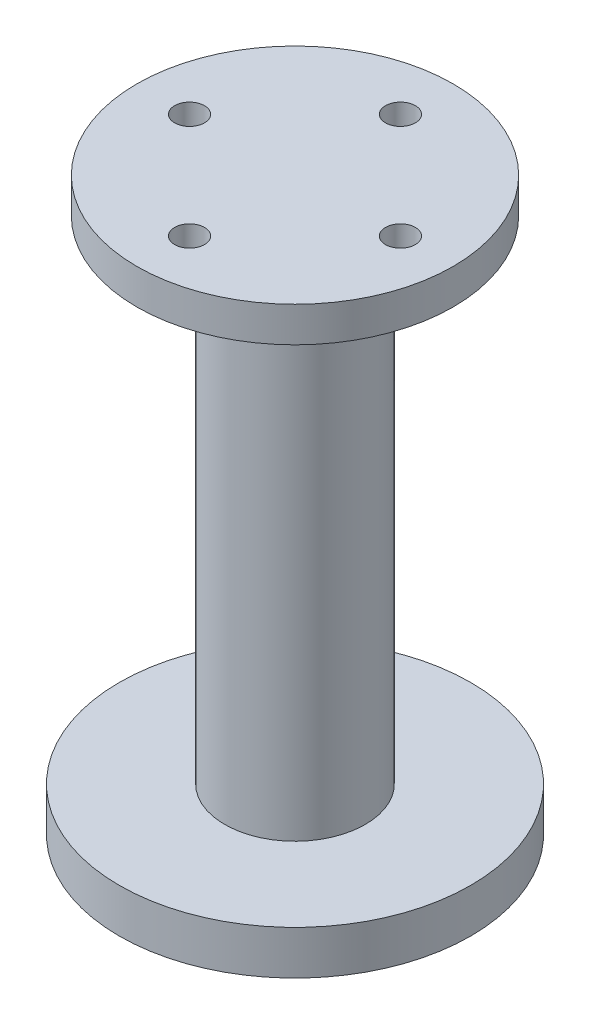
ISO-10303-21;
HEADER;
FILE_DESCRIPTION(('STEP AP214'),'2;1');
FILE_NAME('part.step','',(''),(''),'','','');
FILE_SCHEMA(('AUTOMOTIVE_DESIGN { 1 0 10303 214 1 1 1 1 }'));
ENDSEC;
DATA;
#1=APPLICATION_CONTEXT('core data for automotive mechanical design processes');
#2=APPLICATION_PROTOCOL_DEFINITION('international standard','automotive_design',2000,#1);
#3=PRODUCT_CONTEXT('',#1,'mechanical');
#4=PRODUCT('Part','Part','',(#3));
#5=PRODUCT_RELATED_PRODUCT_CATEGORY('part','',(#4));
#6=PRODUCT_DEFINITION_FORMATION('','',#4);
#7=PRODUCT_DEFINITION_CONTEXT('part definition',#1,'design');
#8=PRODUCT_DEFINITION('design','',#6,#7);
#9=PRODUCT_DEFINITION_SHAPE('','',#8);
#10=(LENGTH_UNIT() NAMED_UNIT(*) SI_UNIT(.MILLI.,.METRE.));
#11=(NAMED_UNIT(*) PLANE_ANGLE_UNIT() SI_UNIT($,.RADIAN.));
#12=(NAMED_UNIT(*) SI_UNIT($,.STERADIAN.) SOLID_ANGLE_UNIT());
#13=UNCERTAINTY_MEASURE_WITH_UNIT(LENGTH_MEASURE(1.E-05),#10,'distance_accuracy_value','');
#14=(GEOMETRIC_REPRESENTATION_CONTEXT(3) GLOBAL_UNCERTAINTY_ASSIGNED_CONTEXT((#13)) GLOBAL_UNIT_ASSIGNED_CONTEXT((#10,
#11,#12)) REPRESENTATION_CONTEXT('',''));
#15=CARTESIAN_POINT('',(0.,0.,0.));
#16=DIRECTION('',(0.,0.,1.));
#17=DIRECTION('',(1.,0.,0.));
#18=AXIS2_PLACEMENT_3D('',#15,#16,#17);
#19=CARTESIAN_POINT('',(0.,0.,0.));
#20=DIRECTION('',(0.,1.,0.));
#21=DIRECTION('',(0.,0.,1.));
#22=AXIS2_PLACEMENT_3D('',#19,#20,#21);
#23=PLANE('',#22);
#24=CARTESIAN_POINT('',(0.,0.,0.));
#25=DIRECTION('',(0.,-1.,0.));
#26=DIRECTION('',(0.,0.,-1.));
#27=AXIS2_PLACEMENT_3D('',#24,#25,#26);
#28=CIRCLE('',#27,20.);
#29=CARTESIAN_POINT('',(0.,0.,-20.));
#30=VERTEX_POINT('',#29);
#31=EDGE_CURVE('E10',#30,#30,#28,.T.);
#32=ORIENTED_EDGE('',*,*,#31,.T.);
#33=EDGE_LOOP('',(#32));
#34=FACE_BOUND('',#33,.T.);
#35=ADVANCED_FACE('F43',(#34),#23,.F.);
#36=CARTESIAN_POINT('',(0.,0.,0.));
#37=DIRECTION('',(0.,-1.,0.));
#38=DIRECTION('',(0.,0.,-1.));
#39=AXIS2_PLACEMENT_3D('',#36,#37,#38);
#40=CYLINDRICAL_SURFACE('',#39,20.);
#41=ORIENTED_EDGE('',*,*,#31,.F.);
#42=EDGE_LOOP('',(#41));
#43=FACE_BOUND('',#42,.T.);
#44=CARTESIAN_POINT('',(0.,5.,0.));
#45=DIRECTION('',(0.,-1.,0.));
#46=DIRECTION('',(0.,0.,-1.));
#47=AXIS2_PLACEMENT_3D('',#44,#45,#46);
#48=CIRCLE('',#47,20.);
#49=CARTESIAN_POINT('',(0.,5.,-20.));
#50=VERTEX_POINT('',#49);
#51=EDGE_CURVE('E50',#50,#50,#48,.T.);
#52=ORIENTED_EDGE('',*,*,#51,.T.);
#53=EDGE_LOOP('',(#52));
#54=FACE_BOUND('',#53,.T.);
#55=ADVANCED_FACE('F137',(#43,#54),#40,.T.);
#56=CARTESIAN_POINT('',(-20.,5.,0.));
#57=DIRECTION('',(0.,-1.,0.));
#58=DIRECTION('',(0.,0.,-1.));
#59=AXIS2_PLACEMENT_3D('',#56,#57,#58);
#60=PLANE('',#59);
#61=ORIENTED_EDGE('',*,*,#51,.F.);
#62=EDGE_LOOP('',(#61));
#63=FACE_BOUND('',#62,.T.);
#64=CARTESIAN_POINT('',(0.,5.,0.));
#65=DIRECTION('',(0.,-1.,0.));
#66=DIRECTION('',(0.,0.,-1.));
#67=AXIS2_PLACEMENT_3D('',#64,#65,#66);
#68=CIRCLE('',#67,8.);
#69=CARTESIAN_POINT('',(0.,5.,-8.));
#70=VERTEX_POINT('',#69);
#71=EDGE_CURVE('E55',#70,#70,#68,.T.);
#72=ORIENTED_EDGE('',*,*,#71,.T.);
#73=EDGE_LOOP('',(#72));
#74=FACE_BOUND('',#73,.T.);
#75=ADVANCED_FACE('F141',(#63,#74),#60,.F.);
#76=CARTESIAN_POINT('',(0.,0.,0.));
#77=DIRECTION('',(0.,-1.,0.));
#78=DIRECTION('',(0.,0.,-1.));
#79=AXIS2_PLACEMENT_3D('',#76,#77,#78);
#80=CYLINDRICAL_SURFACE('',#79,8.);
#81=ORIENTED_EDGE('',*,*,#71,.F.);
#82=EDGE_LOOP('',(#81));
#83=FACE_BOUND('',#82,.T.);
#84=CARTESIAN_POINT('',(0.,61.,0.));
#85=DIRECTION('',(0.,-1.,0.));
#86=DIRECTION('',(0.,0.,-1.));
#87=AXIS2_PLACEMENT_3D('',#84,#85,#86);
#88=CIRCLE('',#87,8.);
#89=CARTESIAN_POINT('',(0.,61.,-8.));
#90=VERTEX_POINT('',#89);
#91=EDGE_CURVE('E60',#90,#90,#88,.T.);
#92=ORIENTED_EDGE('',*,*,#91,.T.);
#93=EDGE_LOOP('',(#92));
#94=FACE_BOUND('',#93,.T.);
#95=ADVANCED_FACE('F132',(#83,#94),#80,.T.);
#96=CARTESIAN_POINT('',(-8.,61.,0.));
#97=DIRECTION('',(0.,1.,0.));
#98=DIRECTION('',(0.,0.,1.));
#99=AXIS2_PLACEMENT_3D('',#96,#97,#98);
#100=PLANE('',#99);
#101=CARTESIAN_POINT('',(12.,61.,0.));
#102=DIRECTION('',(0.,1.,0.));
#103=DIRECTION('',(0.,0.,1.));
#104=AXIS2_PLACEMENT_3D('',#101,#102,#103);
#105=CIRCLE('',#104,1.7);
#106=CARTESIAN_POINT('',(12.,61.,1.7));
#107=VERTEX_POINT('',#106);
#108=EDGE_CURVE('E74',#107,#107,#105,.T.);
#109=ORIENTED_EDGE('',*,*,#108,.T.);
#110=EDGE_LOOP('',(#109));
#111=FACE_BOUND('',#110,.T.);
#112=CARTESIAN_POINT('',(0.,61.,12.));
#113=DIRECTION('',(0.,1.,0.));
#114=DIRECTION('',(0.,0.,1.));
#115=AXIS2_PLACEMENT_3D('',#112,#113,#114);
#116=CIRCLE('',#115,1.7);
#117=CARTESIAN_POINT('',(0.,61.,13.7));
#118=VERTEX_POINT('',#117);
#119=EDGE_CURVE('E78',#118,#118,#116,.T.);
#120=ORIENTED_EDGE('',*,*,#119,.T.);
#121=EDGE_LOOP('',(#120));
#122=FACE_BOUND('',#121,.T.);
#123=CARTESIAN_POINT('',(-12.,61.,0.));
#124=DIRECTION('',(0.,1.,0.));
#125=DIRECTION('',(0.,0.,1.));
#126=AXIS2_PLACEMENT_3D('',#123,#124,#125);
#127=CIRCLE('',#126,1.7);
#128=CARTESIAN_POINT('',(-12.,61.,1.69999999999992));
#129=VERTEX_POINT('',#128);
#130=EDGE_CURVE('E82',#129,#129,#127,.T.);
#131=ORIENTED_EDGE('',*,*,#130,.T.);
#132=EDGE_LOOP('',(#131));
#133=FACE_BOUND('',#132,.T.);
#134=CARTESIAN_POINT('',(1.25693328198353E-13,61.,-12.));
#135=DIRECTION('',(0.,1.,0.));
#136=DIRECTION('',(0.,0.,1.));
#137=AXIS2_PLACEMENT_3D('',#134,#135,#136);
#138=CIRCLE('',#137,1.7);
#139=CARTESIAN_POINT('',(1.25693328198353E-13,61.,-10.3));
#140=VERTEX_POINT('',#139);
#141=EDGE_CURVE('E86',#140,#140,#138,.T.);
#142=ORIENTED_EDGE('',*,*,#141,.T.);
#143=EDGE_LOOP('',(#142));
#144=FACE_BOUND('',#143,.T.);
#145=ORIENTED_EDGE('',*,*,#91,.F.);
#146=EDGE_LOOP('',(#145));
#147=FACE_BOUND('',#146,.T.);
#148=CARTESIAN_POINT('',(0.,61.,0.));
#149=DIRECTION('',(0.,-1.,0.));
#150=DIRECTION('',(0.,0.,-1.));
#151=AXIS2_PLACEMENT_3D('',#148,#149,#150);
#152=CIRCLE('',#151,18.);
#153=CARTESIAN_POINT('',(0.,61.,-18.));
#154=VERTEX_POINT('',#153);
#155=EDGE_CURVE('E66',#154,#154,#152,.T.);
#156=ORIENTED_EDGE('',*,*,#155,.T.);
#157=EDGE_LOOP('',(#156));
#158=FACE_BOUND('',#157,.T.);
#159=ADVANCED_FACE('F125',(#111,#122,#133,#144,#147,#158),#100,.F.);
#160=CARTESIAN_POINT('',(0.,0.,0.));
#161=DIRECTION('',(0.,-1.,0.));
#162=DIRECTION('',(0.,0.,-1.));
#163=AXIS2_PLACEMENT_3D('',#160,#161,#162);
#164=CYLINDRICAL_SURFACE('',#163,18.);
#165=ORIENTED_EDGE('',*,*,#155,.F.);
#166=EDGE_LOOP('',(#165));
#167=FACE_BOUND('',#166,.T.);
#168=CARTESIAN_POINT('',(0.,65.,0.));
#169=DIRECTION('',(0.,-1.,0.));
#170=DIRECTION('',(0.,0.,-1.));
#171=AXIS2_PLACEMENT_3D('',#168,#169,#170);
#172=CIRCLE('',#171,18.);
#173=CARTESIAN_POINT('',(0.,65.,-18.));
#174=VERTEX_POINT('',#173);
#175=EDGE_CURVE('E70',#174,#174,#172,.T.);
#176=ORIENTED_EDGE('',*,*,#175,.T.);
#177=EDGE_LOOP('',(#176));
#178=FACE_BOUND('',#177,.T.);
#179=ADVANCED_FACE('F114',(#167,#178),#164,.T.);
#180=CARTESIAN_POINT('',(-18.,65.,0.));
#181=DIRECTION('',(0.,-1.,0.));
#182=DIRECTION('',(0.,0.,-1.));
#183=AXIS2_PLACEMENT_3D('',#180,#181,#182);
#184=PLANE('',#183);
#185=CARTESIAN_POINT('',(12.,65.,0.));
#186=DIRECTION('',(0.,1.,0.));
#187=DIRECTION('',(0.,0.,1.));
#188=AXIS2_PLACEMENT_3D('',#185,#186,#187);
#189=CIRCLE('',#188,1.7);
#190=CARTESIAN_POINT('',(12.,65.,1.7));
#191=VERTEX_POINT('',#190);
#192=EDGE_CURVE('E90',#191,#191,#189,.T.);
#193=ORIENTED_EDGE('',*,*,#192,.F.);
#194=EDGE_LOOP('',(#193));
#195=FACE_BOUND('',#194,.T.);
#196=CARTESIAN_POINT('',(0.,65.,12.));
#197=DIRECTION('',(0.,1.,0.));
#198=DIRECTION('',(0.,0.,1.));
#199=AXIS2_PLACEMENT_3D('',#196,#197,#198);
#200=CIRCLE('',#199,1.7);
#201=CARTESIAN_POINT('',(0.,65.,13.7));
#202=VERTEX_POINT('',#201);
#203=EDGE_CURVE('E99',#202,#202,#200,.T.);
#204=ORIENTED_EDGE('',*,*,#203,.F.);
#205=EDGE_LOOP('',(#204));
#206=FACE_BOUND('',#205,.T.);
#207=CARTESIAN_POINT('',(-12.,65.,0.));
#208=DIRECTION('',(0.,1.,0.));
#209=DIRECTION('',(0.,0.,1.));
#210=AXIS2_PLACEMENT_3D('',#207,#208,#209);
#211=CIRCLE('',#210,1.7);
#212=CARTESIAN_POINT('',(-12.,65.,1.69999999999992));
#213=VERTEX_POINT('',#212);
#214=EDGE_CURVE('E95',#213,#213,#211,.T.);
#215=ORIENTED_EDGE('',*,*,#214,.F.);
#216=EDGE_LOOP('',(#215));
#217=FACE_BOUND('',#216,.T.);
#218=CARTESIAN_POINT('',(1.25693328198353E-13,65.,-12.));
#219=DIRECTION('',(0.,1.,0.));
#220=DIRECTION('',(0.,0.,1.));
#221=AXIS2_PLACEMENT_3D('',#218,#219,#220);
#222=CIRCLE('',#221,1.7);
#223=CARTESIAN_POINT('',(1.25693328198353E-13,65.,-10.3));
#224=VERTEX_POINT('',#223);
#225=EDGE_CURVE('E91',#224,#224,#222,.T.);
#226=ORIENTED_EDGE('',*,*,#225,.F.);
#227=EDGE_LOOP('',(#226));
#228=FACE_BOUND('',#227,.T.);
#229=ORIENTED_EDGE('',*,*,#175,.F.);
#230=EDGE_LOOP('',(#229));
#231=FACE_BOUND('',#230,.T.);
#232=ADVANCED_FACE('F110',(#195,#206,#217,#228,#231),#184,.F.);
#233=CARTESIAN_POINT('',(1.25693328198353E-13,55.,-12.));
#234=DIRECTION('',(0.,1.,0.));
#235=DIRECTION('',(0.,0.,1.));
#236=AXIS2_PLACEMENT_3D('',#233,#234,#235);
#237=CYLINDRICAL_SURFACE('',#236,1.7);
#238=ORIENTED_EDGE('',*,*,#225,.T.);
#239=EDGE_LOOP('',(#238));
#240=FACE_BOUND('',#239,.T.);
#241=ORIENTED_EDGE('',*,*,#141,.F.);
#242=EDGE_LOOP('',(#241));
#243=FACE_BOUND('',#242,.T.);
#244=ADVANCED_FACE('F113',(#240,#243),#237,.F.);
#245=CARTESIAN_POINT('',(-12.,55.,0.));
#246=DIRECTION('',(0.,1.,0.));
#247=DIRECTION('',(0.,0.,1.));
#248=AXIS2_PLACEMENT_3D('',#245,#246,#247);
#249=CYLINDRICAL_SURFACE('',#248,1.7);
#250=ORIENTED_EDGE('',*,*,#214,.T.);
#251=EDGE_LOOP('',(#250));
#252=FACE_BOUND('',#251,.T.);
#253=ORIENTED_EDGE('',*,*,#130,.F.);
#254=EDGE_LOOP('',(#253));
#255=FACE_BOUND('',#254,.T.);
#256=ADVANCED_FACE('F183',(#252,#255),#249,.F.);
#257=CARTESIAN_POINT('',(0.,55.,12.));
#258=DIRECTION('',(0.,1.,0.));
#259=DIRECTION('',(0.,0.,1.));
#260=AXIS2_PLACEMENT_3D('',#257,#258,#259);
#261=CYLINDRICAL_SURFACE('',#260,1.7);
#262=ORIENTED_EDGE('',*,*,#203,.T.);
#263=EDGE_LOOP('',(#262));
#264=FACE_BOUND('',#263,.T.);
#265=ORIENTED_EDGE('',*,*,#119,.F.);
#266=EDGE_LOOP('',(#265));
#267=FACE_BOUND('',#266,.T.);
#268=ADVANCED_FACE('F191',(#264,#267),#261,.F.);
#269=CARTESIAN_POINT('',(12.,55.,0.));
#270=DIRECTION('',(0.,1.,0.));
#271=DIRECTION('',(0.,0.,1.));
#272=AXIS2_PLACEMENT_3D('',#269,#270,#271);
#273=CYLINDRICAL_SURFACE('',#272,1.7);
#274=ORIENTED_EDGE('',*,*,#192,.T.);
#275=EDGE_LOOP('',(#274));
#276=FACE_BOUND('',#275,.T.);
#277=ORIENTED_EDGE('',*,*,#108,.F.);
#278=EDGE_LOOP('',(#277));
#279=FACE_BOUND('',#278,.T.);
#280=ADVANCED_FACE('F107',(#276,#279),#273,.F.);
#281=CLOSED_SHELL('',(#35,#55,#75,#95,#159,#179,#232,#244,#256,#268,#280));
#282=MANIFOLD_SOLID_BREP('B2',#281);
#283=ADVANCED_BREP_SHAPE_REPRESENTATION('',(#18,#282),#14);
#284=SHAPE_DEFINITION_REPRESENTATION(#9,#283);
ENDSEC;
END-ISO-10303-21;
